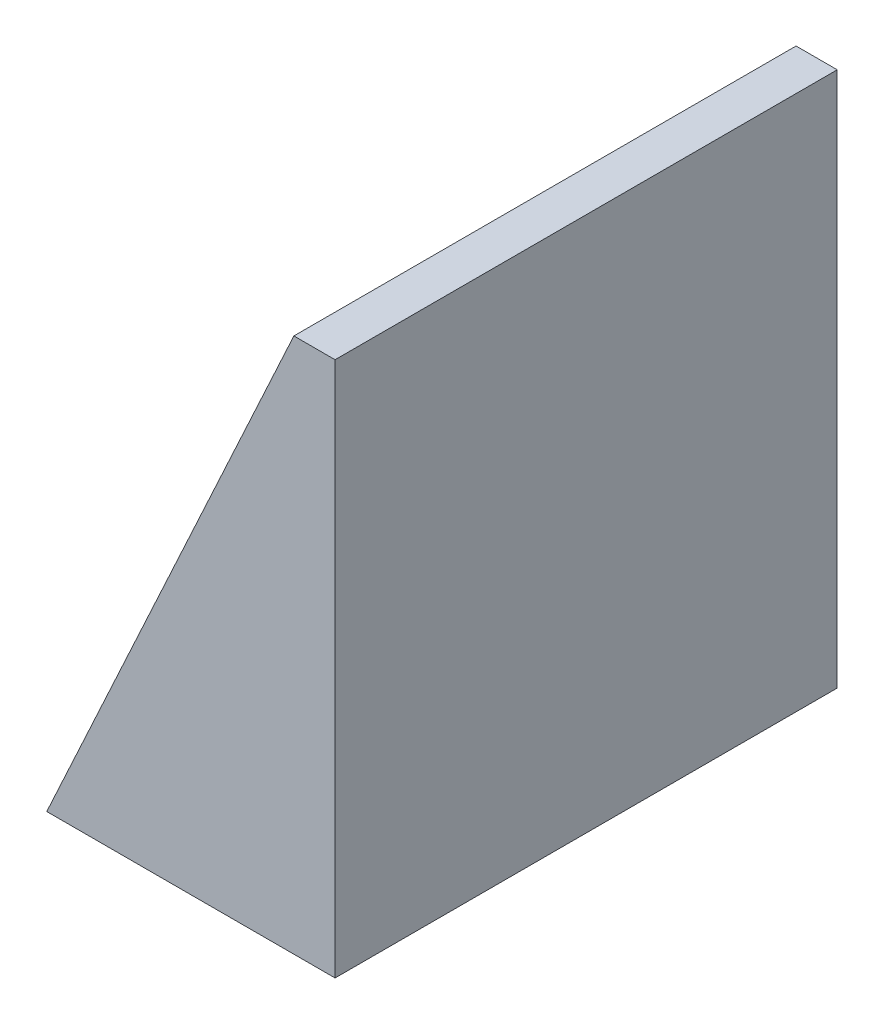
ISO-10303-21;
HEADER;
FILE_DESCRIPTION(('STEP AP214'),'2;1');
FILE_NAME('part.step','',(''),(''),'','','');
FILE_SCHEMA(('AUTOMOTIVE_DESIGN { 1 0 10303 214 1 1 1 1 }'));
ENDSEC;
DATA;
#1=APPLICATION_CONTEXT('core data for automotive mechanical design processes');
#2=APPLICATION_PROTOCOL_DEFINITION('international standard','automotive_design',2000,#1);
#3=PRODUCT_CONTEXT('',#1,'mechanical');
#4=PRODUCT('Part','Part','',(#3));
#5=PRODUCT_RELATED_PRODUCT_CATEGORY('part','',(#4));
#6=PRODUCT_DEFINITION_FORMATION('','',#4);
#7=PRODUCT_DEFINITION_CONTEXT('part definition',#1,'design');
#8=PRODUCT_DEFINITION('design','',#6,#7);
#9=PRODUCT_DEFINITION_SHAPE('','',#8);
#10=(LENGTH_UNIT() NAMED_UNIT(*) SI_UNIT(.MILLI.,.METRE.));
#11=(NAMED_UNIT(*) PLANE_ANGLE_UNIT() SI_UNIT($,.RADIAN.));
#12=(NAMED_UNIT(*) SI_UNIT($,.STERADIAN.) SOLID_ANGLE_UNIT());
#13=UNCERTAINTY_MEASURE_WITH_UNIT(LENGTH_MEASURE(1.E-05),#10,'distance_accuracy_value','');
#14=(GEOMETRIC_REPRESENTATION_CONTEXT(3) GLOBAL_UNCERTAINTY_ASSIGNED_CONTEXT((#13)) GLOBAL_UNIT_ASSIGNED_CONTEXT((#10,
#11,#12)) REPRESENTATION_CONTEXT('',''));
#15=CARTESIAN_POINT('',(0.,0.,0.));
#16=DIRECTION('',(0.,0.,1.));
#17=DIRECTION('',(1.,0.,0.));
#18=AXIS2_PLACEMENT_3D('',#15,#16,#17);
#19=CARTESIAN_POINT('',(-300.,-650.,609.6));
#20=DIRECTION('',(0.907959384500452,-0.419058177461747,0.));
#21=DIRECTION('',(0.419058177461747,0.907959384500452,0.));
#22=AXIS2_PLACEMENT_3D('',#19,#20,#21);
#23=PLANE('',#22);
#24=DIRECTION('',(-0.419058177461747,-0.907959384500452,0.));
#25=VECTOR('',#24,1.);
#26=CARTESIAN_POINT('',(-300.,-650.,0.));
#27=LINE('',#26,#25);
#28=CARTESIAN_POINT('',(0.,0.,0.));
#29=VERTEX_POINT('',#28);
#30=CARTESIAN_POINT('',(-300.,-650.,0.));
#31=VERTEX_POINT('',#30);
#32=EDGE_CURVE('E102',#29,#31,#27,.T.);
#33=ORIENTED_EDGE('',*,*,#32,.T.);
#34=DIRECTION('',(0.,0.,-1.));
#35=VECTOR('',#34,1.);
#36=CARTESIAN_POINT('',(-300.,-650.,609.6));
#37=LINE('',#36,#35);
#38=CARTESIAN_POINT('',(-300.,-650.,609.6));
#39=VERTEX_POINT('',#38);
#40=EDGE_CURVE('E11',#39,#31,#37,.T.);
#41=ORIENTED_EDGE('',*,*,#40,.F.);
#42=DIRECTION('',(-0.419058177461747,-0.907959384500452,0.));
#43=VECTOR('',#42,1.);
#44=CARTESIAN_POINT('',(-300.,-650.,609.6));
#45=LINE('',#44,#43);
#46=CARTESIAN_POINT('',(0.,0.,609.6));
#47=VERTEX_POINT('',#46);
#48=EDGE_CURVE('E90',#47,#39,#45,.T.);
#49=ORIENTED_EDGE('',*,*,#48,.F.);
#50=DIRECTION('',(0.,0.,-1.));
#51=VECTOR('',#50,1.);
#52=CARTESIAN_POINT('',(0.,0.,609.6));
#53=LINE('',#52,#51);
#54=EDGE_CURVE('E98',#47,#29,#53,.T.);
#55=ORIENTED_EDGE('',*,*,#54,.T.);
#56=EDGE_LOOP('',(#33,#41,#49,#55));
#57=FACE_BOUND('',#56,.T.);
#58=ADVANCED_FACE('F39',(#57),#23,.F.);
#59=CARTESIAN_POINT('',(50.0000000000001,-650.,609.6));
#60=DIRECTION('',(0.,1.,0.));
#61=DIRECTION('',(0.,0.,1.));
#62=AXIS2_PLACEMENT_3D('',#59,#60,#61);
#63=PLANE('',#62);
#64=DIRECTION('',(1.,0.,0.));
#65=VECTOR('',#64,1.);
#66=CARTESIAN_POINT('',(50.0000000000001,-650.,0.));
#67=LINE('',#66,#65);
#68=CARTESIAN_POINT('',(50.0000000000001,-650.,0.));
#69=VERTEX_POINT('',#68);
#70=EDGE_CURVE('E94',#31,#69,#67,.T.);
#71=ORIENTED_EDGE('',*,*,#70,.T.);
#72=DIRECTION('',(0.,0.,-1.));
#73=VECTOR('',#72,1.);
#74=CARTESIAN_POINT('',(50.0000000000001,-650.,609.6));
#75=LINE('',#74,#73);
#76=CARTESIAN_POINT('',(50.0000000000001,-650.,609.6));
#77=VERTEX_POINT('',#76);
#78=EDGE_CURVE('E47',#77,#69,#75,.T.);
#79=ORIENTED_EDGE('',*,*,#78,.F.);
#80=DIRECTION('',(1.,0.,0.));
#81=VECTOR('',#80,1.);
#82=CARTESIAN_POINT('',(50.0000000000001,-650.,609.6));
#83=LINE('',#82,#81);
#84=EDGE_CURVE('E85',#39,#77,#83,.T.);
#85=ORIENTED_EDGE('',*,*,#84,.F.);
#86=ORIENTED_EDGE('',*,*,#40,.T.);
#87=EDGE_LOOP('',(#71,#79,#85,#86));
#88=FACE_BOUND('',#87,.T.);
#89=ADVANCED_FACE('F93',(#88),#63,.F.);
#90=CARTESIAN_POINT('',(50.,0.,609.6));
#91=DIRECTION('',(-1.,0.,0.));
#92=DIRECTION('',(0.,-1.,0.));
#93=AXIS2_PLACEMENT_3D('',#90,#91,#92);
#94=PLANE('',#93);
#95=DIRECTION('',(0.,1.,0.));
#96=VECTOR('',#95,1.);
#97=CARTESIAN_POINT('',(50.,0.,0.));
#98=LINE('',#97,#96);
#99=CARTESIAN_POINT('',(50.,0.,0.));
#100=VERTEX_POINT('',#99);
#101=EDGE_CURVE('E72',#69,#100,#98,.T.);
#102=ORIENTED_EDGE('',*,*,#101,.T.);
#103=DIRECTION('',(0.,0.,-1.));
#104=VECTOR('',#103,1.);
#105=CARTESIAN_POINT('',(50.,0.,609.6));
#106=LINE('',#105,#104);
#107=CARTESIAN_POINT('',(50.,0.,609.6));
#108=VERTEX_POINT('',#107);
#109=EDGE_CURVE('E95',#108,#100,#106,.T.);
#110=ORIENTED_EDGE('',*,*,#109,.F.);
#111=DIRECTION('',(0.,1.,0.));
#112=VECTOR('',#111,1.);
#113=CARTESIAN_POINT('',(50.,0.,609.6));
#114=LINE('',#113,#112);
#115=EDGE_CURVE('E88',#77,#108,#114,.T.);
#116=ORIENTED_EDGE('',*,*,#115,.F.);
#117=ORIENTED_EDGE('',*,*,#78,.T.);
#118=EDGE_LOOP('',(#102,#110,#116,#117));
#119=FACE_BOUND('',#118,.T.);
#120=ADVANCED_FACE('F96',(#119),#94,.F.);
#121=CARTESIAN_POINT('',(0.,0.,609.6));
#122=DIRECTION('',(0.,-1.,0.));
#123=DIRECTION('',(0.,0.,-1.));
#124=AXIS2_PLACEMENT_3D('',#121,#122,#123);
#125=PLANE('',#124);
#126=DIRECTION('',(-1.,0.,0.));
#127=VECTOR('',#126,1.);
#128=CARTESIAN_POINT('',(0.,0.,0.));
#129=LINE('',#128,#127);
#130=EDGE_CURVE('E78',#100,#29,#129,.T.);
#131=ORIENTED_EDGE('',*,*,#130,.T.);
#132=ORIENTED_EDGE('',*,*,#54,.F.);
#133=DIRECTION('',(-1.,0.,0.));
#134=VECTOR('',#133,1.);
#135=CARTESIAN_POINT('',(0.,0.,609.6));
#136=LINE('',#135,#134);
#137=EDGE_CURVE('E55',#108,#47,#136,.T.);
#138=ORIENTED_EDGE('',*,*,#137,.F.);
#139=ORIENTED_EDGE('',*,*,#109,.T.);
#140=EDGE_LOOP('',(#131,#132,#138,#139));
#141=FACE_BOUND('',#140,.T.);
#142=ADVANCED_FACE('F109',(#141),#125,.F.);
#143=CARTESIAN_POINT('',(0.,0.,609.6));
#144=DIRECTION('',(0.,0.,-1.));
#145=DIRECTION('',(-1.,0.,0.));
#146=AXIS2_PLACEMENT_3D('',#143,#144,#145);
#147=PLANE('',#146);
#148=ORIENTED_EDGE('',*,*,#48,.T.);
#149=ORIENTED_EDGE('',*,*,#84,.T.);
#150=ORIENTED_EDGE('',*,*,#115,.T.);
#151=ORIENTED_EDGE('',*,*,#137,.T.);
#152=EDGE_LOOP('',(#148,#149,#150,#151));
#153=FACE_BOUND('',#152,.T.);
#154=ADVANCED_FACE('F86',(#153),#147,.F.);
#155=CARTESIAN_POINT('',(0.,0.,0.));
#156=DIRECTION('',(0.,0.,-1.));
#157=DIRECTION('',(-1.,0.,0.));
#158=AXIS2_PLACEMENT_3D('',#155,#156,#157);
#159=PLANE('',#158);
#160=ORIENTED_EDGE('',*,*,#32,.F.);
#161=ORIENTED_EDGE('',*,*,#130,.F.);
#162=ORIENTED_EDGE('',*,*,#101,.F.);
#163=ORIENTED_EDGE('',*,*,#70,.F.);
#164=EDGE_LOOP('',(#160,#161,#162,#163));
#165=FACE_BOUND('',#164,.T.);
#166=ADVANCED_FACE('F112',(#165),#159,.T.);
#167=CLOSED_SHELL('',(#58,#89,#120,#142,#154,#166));
#168=MANIFOLD_SOLID_BREP('B2',#167);
#169=ADVANCED_BREP_SHAPE_REPRESENTATION('',(#18,#168),#14);
#170=SHAPE_DEFINITION_REPRESENTATION(#9,#169);
ENDSEC;
END-ISO-10303-21;
